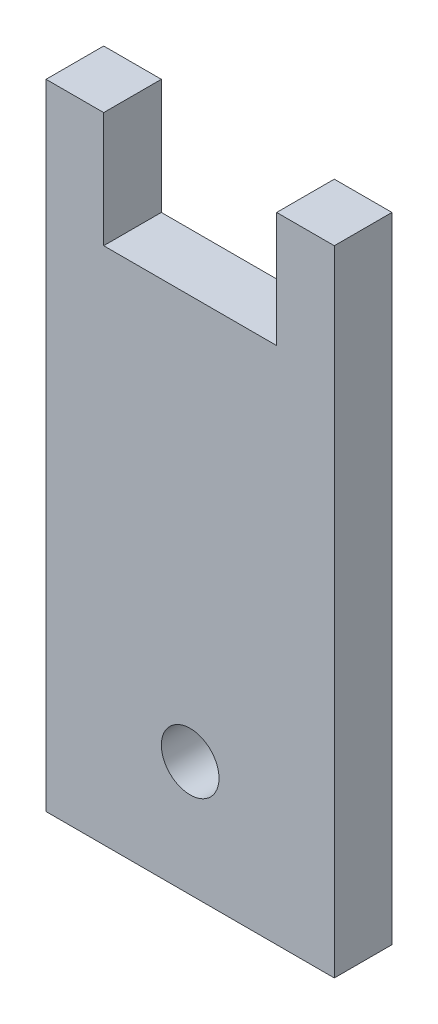
ISO-10303-21;
HEADER;
FILE_DESCRIPTION(('STEP AP214'),'2;1');
FILE_NAME('part.step','',(''),(''),'','','');
FILE_SCHEMA(('AUTOMOTIVE_DESIGN { 1 0 10303 214 1 1 1 1 }'));
ENDSEC;
DATA;
#1=APPLICATION_CONTEXT('core data for automotive mechanical design processes');
#2=APPLICATION_PROTOCOL_DEFINITION('international standard','automotive_design',2000,#1);
#3=PRODUCT_CONTEXT('',#1,'mechanical');
#4=PRODUCT('Part','Part','',(#3));
#5=PRODUCT_RELATED_PRODUCT_CATEGORY('part','',(#4));
#6=PRODUCT_DEFINITION_FORMATION('','',#4);
#7=PRODUCT_DEFINITION_CONTEXT('part definition',#1,'design');
#8=PRODUCT_DEFINITION('design','',#6,#7);
#9=PRODUCT_DEFINITION_SHAPE('','',#8);
#10=(LENGTH_UNIT() NAMED_UNIT(*) SI_UNIT(.MILLI.,.METRE.));
#11=(NAMED_UNIT(*) PLANE_ANGLE_UNIT() SI_UNIT($,.RADIAN.));
#12=(NAMED_UNIT(*) SI_UNIT($,.STERADIAN.) SOLID_ANGLE_UNIT());
#13=UNCERTAINTY_MEASURE_WITH_UNIT(LENGTH_MEASURE(1.E-05),#10,'distance_accuracy_value','');
#14=(GEOMETRIC_REPRESENTATION_CONTEXT(3) GLOBAL_UNCERTAINTY_ASSIGNED_CONTEXT((#13)) GLOBAL_UNIT_ASSIGNED_CONTEXT((#10,
#11,#12)) REPRESENTATION_CONTEXT('',''));
#15=CARTESIAN_POINT('',(0.,0.,0.));
#16=DIRECTION('',(0.,0.,1.));
#17=DIRECTION('',(1.,0.,0.));
#18=AXIS2_PLACEMENT_3D('',#15,#16,#17);
#19=CARTESIAN_POINT('',(12.5,27.5,5.));
#20=DIRECTION('',(-1.,0.,0.));
#21=DIRECTION('',(0.,-1.,0.));
#22=AXIS2_PLACEMENT_3D('',#19,#20,#21);
#23=PLANE('',#22);
#24=DIRECTION('',(0.,1.,0.));
#25=VECTOR('',#24,1.);
#26=CARTESIAN_POINT('',(12.5,27.5,0.));
#27=LINE('',#26,#25);
#28=CARTESIAN_POINT('',(12.5,-27.5,0.));
#29=VERTEX_POINT('',#28);
#30=CARTESIAN_POINT('',(12.5,27.5,0.));
#31=VERTEX_POINT('',#30);
#32=EDGE_CURVE('E140',#29,#31,#27,.T.);
#33=ORIENTED_EDGE('',*,*,#32,.T.);
#34=DIRECTION('',(0.,0.,-1.));
#35=VECTOR('',#34,1.);
#36=CARTESIAN_POINT('',(12.5,27.5,5.));
#37=LINE('',#36,#35);
#38=CARTESIAN_POINT('',(12.5,27.5,5.));
#39=VERTEX_POINT('',#38);
#40=EDGE_CURVE('E11',#39,#31,#37,.T.);
#41=ORIENTED_EDGE('',*,*,#40,.F.);
#42=DIRECTION('',(0.,1.,0.));
#43=VECTOR('',#42,1.);
#44=CARTESIAN_POINT('',(12.5,27.5,5.));
#45=LINE('',#44,#43);
#46=CARTESIAN_POINT('',(12.5,-27.5,5.));
#47=VERTEX_POINT('',#46);
#48=EDGE_CURVE('E163',#47,#39,#45,.T.);
#49=ORIENTED_EDGE('',*,*,#48,.F.);
#50=DIRECTION('',(0.,0.,-1.));
#51=VECTOR('',#50,1.);
#52=CARTESIAN_POINT('',(12.5,-27.5,5.));
#53=LINE('',#52,#51);
#54=EDGE_CURVE('E136',#47,#29,#53,.T.);
#55=ORIENTED_EDGE('',*,*,#54,.T.);
#56=EDGE_LOOP('',(#33,#41,#49,#55));
#57=FACE_BOUND('',#56,.T.);
#58=ADVANCED_FACE('F39',(#57),#23,.F.);
#59=CARTESIAN_POINT('',(7.5,27.5,5.));
#60=DIRECTION('',(0.,-1.,0.));
#61=DIRECTION('',(0.,0.,-1.));
#62=AXIS2_PLACEMENT_3D('',#59,#60,#61);
#63=PLANE('',#62);
#64=DIRECTION('',(-1.,0.,0.));
#65=VECTOR('',#64,1.);
#66=CARTESIAN_POINT('',(7.5,27.5,0.));
#67=LINE('',#66,#65);
#68=CARTESIAN_POINT('',(7.5,27.5,0.));
#69=VERTEX_POINT('',#68);
#70=EDGE_CURVE('E144',#31,#69,#67,.T.);
#71=ORIENTED_EDGE('',*,*,#70,.T.);
#72=DIRECTION('',(0.,0.,-1.));
#73=VECTOR('',#72,1.);
#74=CARTESIAN_POINT('',(7.5,27.5,5.));
#75=LINE('',#74,#73);
#76=CARTESIAN_POINT('',(7.5,27.5,5.));
#77=VERTEX_POINT('',#76);
#78=EDGE_CURVE('E48',#77,#69,#75,.T.);
#79=ORIENTED_EDGE('',*,*,#78,.F.);
#80=DIRECTION('',(-1.,0.,0.));
#81=VECTOR('',#80,1.);
#82=CARTESIAN_POINT('',(7.5,27.5,5.));
#83=LINE('',#82,#81);
#84=EDGE_CURVE('E99',#39,#77,#83,.T.);
#85=ORIENTED_EDGE('',*,*,#84,.F.);
#86=ORIENTED_EDGE('',*,*,#40,.T.);
#87=EDGE_LOOP('',(#71,#79,#85,#86));
#88=FACE_BOUND('',#87,.T.);
#89=ADVANCED_FACE('F232',(#88),#63,.F.);
#90=CARTESIAN_POINT('',(7.5,17.5,5.));
#91=DIRECTION('',(1.,0.,0.));
#92=DIRECTION('',(0.,0.,-1.));
#93=AXIS2_PLACEMENT_3D('',#90,#91,#92);
#94=PLANE('',#93);
#95=DIRECTION('',(0.,-1.,0.));
#96=VECTOR('',#95,1.);
#97=CARTESIAN_POINT('',(7.5,17.5,0.));
#98=LINE('',#97,#96);
#99=CARTESIAN_POINT('',(7.5,17.5,0.));
#100=VERTEX_POINT('',#99);
#101=EDGE_CURVE('E148',#69,#100,#98,.T.);
#102=ORIENTED_EDGE('',*,*,#101,.T.);
#103=DIRECTION('',(0.,0.,-1.));
#104=VECTOR('',#103,1.);
#105=CARTESIAN_POINT('',(7.5,17.5,5.));
#106=LINE('',#105,#104);
#107=CARTESIAN_POINT('',(7.5,17.5,5.));
#108=VERTEX_POINT('',#107);
#109=EDGE_CURVE('E174',#108,#100,#106,.T.);
#110=ORIENTED_EDGE('',*,*,#109,.F.);
#111=DIRECTION('',(0.,-1.,0.));
#112=VECTOR('',#111,1.);
#113=CARTESIAN_POINT('',(7.5,17.5,5.));
#114=LINE('',#113,#112);
#115=EDGE_CURVE('E184',#77,#108,#114,.T.);
#116=ORIENTED_EDGE('',*,*,#115,.F.);
#117=ORIENTED_EDGE('',*,*,#78,.T.);
#118=EDGE_LOOP('',(#102,#110,#116,#117));
#119=FACE_BOUND('',#118,.T.);
#120=ADVANCED_FACE('F182',(#119),#94,.F.);
#121=CARTESIAN_POINT('',(-7.5,17.5,5.));
#122=DIRECTION('',(0.,-1.,0.));
#123=DIRECTION('',(0.,0.,-1.));
#124=AXIS2_PLACEMENT_3D('',#121,#122,#123);
#125=PLANE('',#124);
#126=DIRECTION('',(-1.,0.,0.));
#127=VECTOR('',#126,1.);
#128=CARTESIAN_POINT('',(-7.5,17.5,0.));
#129=LINE('',#128,#127);
#130=CARTESIAN_POINT('',(-7.5,17.5,0.));
#131=VERTEX_POINT('',#130);
#132=EDGE_CURVE('E151',#100,#131,#129,.T.);
#133=ORIENTED_EDGE('',*,*,#132,.T.);
#134=DIRECTION('',(0.,0.,-1.));
#135=VECTOR('',#134,1.);
#136=CARTESIAN_POINT('',(-7.5,17.5,5.));
#137=LINE('',#136,#135);
#138=CARTESIAN_POINT('',(-7.5,17.5,5.));
#139=VERTEX_POINT('',#138);
#140=EDGE_CURVE('E170',#139,#131,#137,.T.);
#141=ORIENTED_EDGE('',*,*,#140,.F.);
#142=DIRECTION('',(-1.,0.,0.));
#143=VECTOR('',#142,1.);
#144=CARTESIAN_POINT('',(-7.5,17.5,5.));
#145=LINE('',#144,#143);
#146=EDGE_CURVE('E197',#108,#139,#145,.T.);
#147=ORIENTED_EDGE('',*,*,#146,.F.);
#148=ORIENTED_EDGE('',*,*,#109,.T.);
#149=EDGE_LOOP('',(#133,#141,#147,#148));
#150=FACE_BOUND('',#149,.T.);
#151=ADVANCED_FACE('F192',(#150),#125,.F.);
#152=CARTESIAN_POINT('',(-7.5,27.5,5.));
#153=DIRECTION('',(-1.,0.,0.));
#154=DIRECTION('',(0.,-1.,0.));
#155=AXIS2_PLACEMENT_3D('',#152,#153,#154);
#156=PLANE('',#155);
#157=DIRECTION('',(0.,1.,0.));
#158=VECTOR('',#157,1.);
#159=CARTESIAN_POINT('',(-7.5,27.5,0.));
#160=LINE('',#159,#158);
#161=CARTESIAN_POINT('',(-7.5,27.5,0.));
#162=VERTEX_POINT('',#161);
#163=EDGE_CURVE('E154',#131,#162,#160,.T.);
#164=ORIENTED_EDGE('',*,*,#163,.T.);
#165=DIRECTION('',(0.,0.,-1.));
#166=VECTOR('',#165,1.);
#167=CARTESIAN_POINT('',(-7.5,27.5,5.));
#168=LINE('',#167,#166);
#169=CARTESIAN_POINT('',(-7.5,27.5,5.));
#170=VERTEX_POINT('',#169);
#171=EDGE_CURVE('E129',#170,#162,#168,.T.);
#172=ORIENTED_EDGE('',*,*,#171,.F.);
#173=DIRECTION('',(0.,1.,0.));
#174=VECTOR('',#173,1.);
#175=CARTESIAN_POINT('',(-7.5,27.5,5.));
#176=LINE('',#175,#174);
#177=EDGE_CURVE('E118',#139,#170,#176,.T.);
#178=ORIENTED_EDGE('',*,*,#177,.F.);
#179=ORIENTED_EDGE('',*,*,#140,.T.);
#180=EDGE_LOOP('',(#164,#172,#178,#179));
#181=FACE_BOUND('',#180,.T.);
#182=ADVANCED_FACE('F195',(#181),#156,.F.);
#183=CARTESIAN_POINT('',(-12.5,27.5,5.));
#184=DIRECTION('',(0.,-1.,0.));
#185=DIRECTION('',(0.,0.,-1.));
#186=AXIS2_PLACEMENT_3D('',#183,#184,#185);
#187=PLANE('',#186);
#188=DIRECTION('',(-1.,0.,0.));
#189=VECTOR('',#188,1.);
#190=CARTESIAN_POINT('',(-12.5,27.5,0.));
#191=LINE('',#190,#189);
#192=CARTESIAN_POINT('',(-12.5,27.5,0.));
#193=VERTEX_POINT('',#192);
#194=EDGE_CURVE('E127',#162,#193,#191,.T.);
#195=ORIENTED_EDGE('',*,*,#194,.T.);
#196=DIRECTION('',(0.,0.,-1.));
#197=VECTOR('',#196,1.);
#198=CARTESIAN_POINT('',(-12.5,27.5,5.));
#199=LINE('',#198,#197);
#200=CARTESIAN_POINT('',(-12.5,27.5,5.));
#201=VERTEX_POINT('',#200);
#202=EDGE_CURVE('E124',#201,#193,#199,.T.);
#203=ORIENTED_EDGE('',*,*,#202,.F.);
#204=DIRECTION('',(-1.,0.,0.));
#205=VECTOR('',#204,1.);
#206=CARTESIAN_POINT('',(-12.5,27.5,5.));
#207=LINE('',#206,#205);
#208=EDGE_CURVE('E112',#170,#201,#207,.T.);
#209=ORIENTED_EDGE('',*,*,#208,.F.);
#210=ORIENTED_EDGE('',*,*,#171,.T.);
#211=EDGE_LOOP('',(#195,#203,#209,#210));
#212=FACE_BOUND('',#211,.T.);
#213=ADVANCED_FACE('F125',(#212),#187,.F.);
#214=CARTESIAN_POINT('',(-12.5,27.5,5.));
#215=DIRECTION('',(1.,0.,0.));
#216=DIRECTION('',(0.,1.,0.));
#217=AXIS2_PLACEMENT_3D('',#214,#215,#216);
#218=PLANE('',#217);
#219=DIRECTION('',(0.,-1.,0.));
#220=VECTOR('',#219,1.);
#221=CARTESIAN_POINT('',(-12.5,27.5,0.));
#222=LINE('',#221,#220);
#223=CARTESIAN_POINT('',(-12.5,-27.5,0.));
#224=VERTEX_POINT('',#223);
#225=EDGE_CURVE('E85',#193,#224,#222,.T.);
#226=ORIENTED_EDGE('',*,*,#225,.T.);
#227=DIRECTION('',(0.,0.,-1.));
#228=VECTOR('',#227,1.);
#229=CARTESIAN_POINT('',(-12.5,-27.5,5.));
#230=LINE('',#229,#228);
#231=CARTESIAN_POINT('',(-12.5,-27.5,5.));
#232=VERTEX_POINT('',#231);
#233=EDGE_CURVE('E130',#232,#224,#230,.T.);
#234=ORIENTED_EDGE('',*,*,#233,.F.);
#235=DIRECTION('',(0.,-1.,0.));
#236=VECTOR('',#235,1.);
#237=CARTESIAN_POINT('',(-12.5,27.5,5.));
#238=LINE('',#237,#236);
#239=EDGE_CURVE('E116',#201,#232,#238,.T.);
#240=ORIENTED_EDGE('',*,*,#239,.F.);
#241=ORIENTED_EDGE('',*,*,#202,.T.);
#242=EDGE_LOOP('',(#226,#234,#240,#241));
#243=FACE_BOUND('',#242,.T.);
#244=ADVANCED_FACE('F132',(#243),#218,.F.);
#245=CARTESIAN_POINT('',(-12.5,-27.5,5.));
#246=DIRECTION('',(0.,1.,0.));
#247=DIRECTION('',(0.,0.,1.));
#248=AXIS2_PLACEMENT_3D('',#245,#246,#247);
#249=PLANE('',#248);
#250=DIRECTION('',(1.,0.,0.));
#251=VECTOR('',#250,1.);
#252=CARTESIAN_POINT('',(-12.5,-27.5,0.));
#253=LINE('',#252,#251);
#254=EDGE_CURVE('E91',#224,#29,#253,.T.);
#255=ORIENTED_EDGE('',*,*,#254,.T.);
#256=ORIENTED_EDGE('',*,*,#54,.F.);
#257=DIRECTION('',(1.,0.,0.));
#258=VECTOR('',#257,1.);
#259=CARTESIAN_POINT('',(-12.5,-27.5,5.));
#260=LINE('',#259,#258);
#261=EDGE_CURVE('E56',#232,#47,#260,.T.);
#262=ORIENTED_EDGE('',*,*,#261,.F.);
#263=ORIENTED_EDGE('',*,*,#233,.T.);
#264=EDGE_LOOP('',(#255,#256,#262,#263));
#265=FACE_BOUND('',#264,.T.);
#266=ADVANCED_FACE('F223',(#265),#249,.F.);
#267=CARTESIAN_POINT('',(0.,0.,5.));
#268=DIRECTION('',(0.,0.,1.));
#269=DIRECTION('',(1.,0.,0.));
#270=AXIS2_PLACEMENT_3D('',#267,#268,#269);
#271=PLANE('',#270);
#272=CARTESIAN_POINT('',(0.,-17.5,5.));
#273=DIRECTION('',(0.,0.,1.));
#274=DIRECTION('',(1.,0.,0.));
#275=AXIS2_PLACEMENT_3D('',#272,#273,#274);
#276=CIRCLE('',#275,2.5);
#277=CARTESIAN_POINT('',(2.5,-17.5,5.));
#278=VERTEX_POINT('',#277);
#279=EDGE_CURVE('E207',#278,#278,#276,.T.);
#280=ORIENTED_EDGE('',*,*,#279,.F.);
#281=EDGE_LOOP('',(#280));
#282=FACE_BOUND('',#281,.T.);
#283=ORIENTED_EDGE('',*,*,#48,.T.);
#284=ORIENTED_EDGE('',*,*,#84,.T.);
#285=ORIENTED_EDGE('',*,*,#115,.T.);
#286=ORIENTED_EDGE('',*,*,#146,.T.);
#287=ORIENTED_EDGE('',*,*,#177,.T.);
#288=ORIENTED_EDGE('',*,*,#208,.T.);
#289=ORIENTED_EDGE('',*,*,#239,.T.);
#290=ORIENTED_EDGE('',*,*,#261,.T.);
#291=EDGE_LOOP('',(#283,#284,#285,#286,#287,#288,#289,#290));
#292=FACE_BOUND('',#291,.T.);
#293=ADVANCED_FACE('F114',(#282,#292),#271,.T.);
#294=CARTESIAN_POINT('',(0.,0.,0.));
#295=DIRECTION('',(0.,0.,1.));
#296=DIRECTION('',(1.,0.,0.));
#297=AXIS2_PLACEMENT_3D('',#294,#295,#296);
#298=PLANE('',#297);
#299=CARTESIAN_POINT('',(0.,-17.5,0.));
#300=DIRECTION('',(0.,0.,1.));
#301=DIRECTION('',(1.,0.,0.));
#302=AXIS2_PLACEMENT_3D('',#299,#300,#301);
#303=CIRCLE('',#302,2.5);
#304=CARTESIAN_POINT('',(2.5,-17.5,0.));
#305=VERTEX_POINT('',#304);
#306=EDGE_CURVE('E145',#305,#305,#303,.T.);
#307=ORIENTED_EDGE('',*,*,#306,.T.);
#308=EDGE_LOOP('',(#307));
#309=FACE_BOUND('',#308,.T.);
#310=ORIENTED_EDGE('',*,*,#32,.F.);
#311=ORIENTED_EDGE('',*,*,#254,.F.);
#312=ORIENTED_EDGE('',*,*,#225,.F.);
#313=ORIENTED_EDGE('',*,*,#194,.F.);
#314=ORIENTED_EDGE('',*,*,#163,.F.);
#315=ORIENTED_EDGE('',*,*,#132,.F.);
#316=ORIENTED_EDGE('',*,*,#101,.F.);
#317=ORIENTED_EDGE('',*,*,#70,.F.);
#318=EDGE_LOOP('',(#310,#311,#312,#313,#314,#315,#316,#317));
#319=FACE_BOUND('',#318,.T.);
#320=ADVANCED_FACE('F188',(#309,#319),#298,.F.);
#321=CARTESIAN_POINT('',(0.,-17.5,0.));
#322=DIRECTION('',(0.,0.,1.));
#323=DIRECTION('',(1.,0.,0.));
#324=AXIS2_PLACEMENT_3D('',#321,#322,#323);
#325=CYLINDRICAL_SURFACE('',#324,2.5);
#326=ORIENTED_EDGE('',*,*,#306,.F.);
#327=EDGE_LOOP('',(#326));
#328=FACE_BOUND('',#327,.T.);
#329=ORIENTED_EDGE('',*,*,#279,.T.);
#330=EDGE_LOOP('',(#329));
#331=FACE_BOUND('',#330,.T.);
#332=ADVANCED_FACE('F216',(#328,#331),#325,.F.);
#333=CLOSED_SHELL('',(#58,#89,#120,#151,#182,#213,#244,#266,#293,#320,#332));
#334=MANIFOLD_SOLID_BREP('B2',#333);
#335=ADVANCED_BREP_SHAPE_REPRESENTATION('',(#18,#334),#14);
#336=SHAPE_DEFINITION_REPRESENTATION(#9,#335);
ENDSEC;
END-ISO-10303-21;
